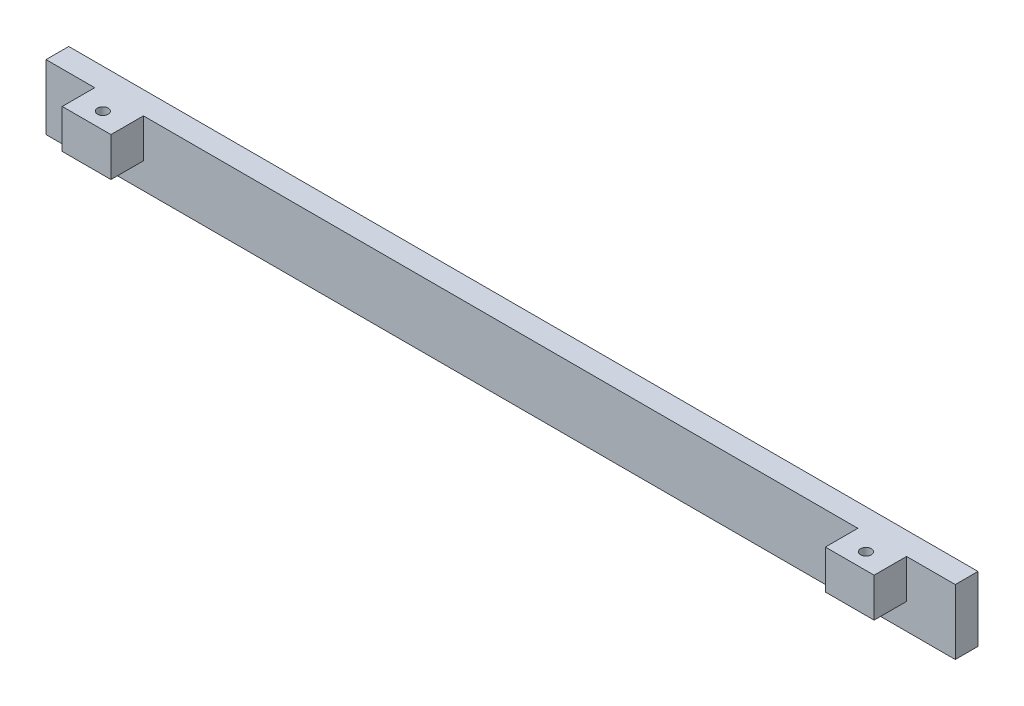
ISO-10303-21;
HEADER;
FILE_DESCRIPTION(('STEP AP214'),'2;1');
FILE_NAME('part.step','',(''),(''),'','','');
FILE_SCHEMA(('AUTOMOTIVE_DESIGN { 1 0 10303 214 1 1 1 1 }'));
ENDSEC;
DATA;
#1=APPLICATION_CONTEXT('core data for automotive mechanical design processes');
#2=APPLICATION_PROTOCOL_DEFINITION('international standard','automotive_design',2000,#1);
#3=PRODUCT_CONTEXT('',#1,'mechanical');
#4=PRODUCT('Part','Part','',(#3));
#5=PRODUCT_RELATED_PRODUCT_CATEGORY('part','',(#4));
#6=PRODUCT_DEFINITION_FORMATION('','',#4);
#7=PRODUCT_DEFINITION_CONTEXT('part definition',#1,'design');
#8=PRODUCT_DEFINITION('design','',#6,#7);
#9=PRODUCT_DEFINITION_SHAPE('','',#8);
#10=(LENGTH_UNIT() NAMED_UNIT(*) SI_UNIT(.MILLI.,.METRE.));
#11=(NAMED_UNIT(*) PLANE_ANGLE_UNIT() SI_UNIT($,.RADIAN.));
#12=(NAMED_UNIT(*) SI_UNIT($,.STERADIAN.) SOLID_ANGLE_UNIT());
#13=UNCERTAINTY_MEASURE_WITH_UNIT(LENGTH_MEASURE(1.E-05),#10,'distance_accuracy_value','');
#14=(GEOMETRIC_REPRESENTATION_CONTEXT(3) GLOBAL_UNCERTAINTY_ASSIGNED_CONTEXT((#13)) GLOBAL_UNIT_ASSIGNED_CONTEXT((#10,
#11,#12)) REPRESENTATION_CONTEXT('',''));
#15=CARTESIAN_POINT('',(0.,0.,0.));
#16=DIRECTION('',(0.,0.,1.));
#17=DIRECTION('',(1.,0.,0.));
#18=AXIS2_PLACEMENT_3D('',#15,#16,#17);
#19=CARTESIAN_POINT('',(140.,-9.99999999999999,3.5));
#20=DIRECTION('',(0.,0.,-1.));
#21=DIRECTION('',(-1.,0.,0.));
#22=AXIS2_PLACEMENT_3D('',#19,#20,#21);
#23=PLANE('',#22);
#24=DIRECTION('',(-1.,0.,0.));
#25=VECTOR('',#24,1.);
#26=CARTESIAN_POINT('',(140.,10.,3.5));
#27=LINE('',#26,#25);
#28=CARTESIAN_POINT('',(140.,10.,3.5));
#29=VERTEX_POINT('',#28);
#30=CARTESIAN_POINT('',(125.,10.,3.5));
#31=VERTEX_POINT('',#30);
#32=EDGE_CURVE('E46',#29,#31,#27,.T.);
#33=ORIENTED_EDGE('',*,*,#32,.T.);
#34=DIRECTION('',(0.,-1.,0.));
#35=VECTOR('',#34,1.);
#36=CARTESIAN_POINT('',(125.,10.,3.5));
#37=LINE('',#36,#35);
#38=CARTESIAN_POINT('',(125.,-1.99999999999999,3.5));
#39=VERTEX_POINT('',#38);
#40=EDGE_CURVE('E59',#31,#39,#37,.T.);
#41=ORIENTED_EDGE('',*,*,#40,.T.);
#42=DIRECTION('',(-1.,0.,0.));
#43=VECTOR('',#42,1.);
#44=CARTESIAN_POINT('',(125.,-1.99999999999999,3.5));
#45=LINE('',#44,#43);
#46=CARTESIAN_POINT('',(110.,-1.99999999999999,3.5));
#47=VERTEX_POINT('',#46);
#48=EDGE_CURVE('E54',#39,#47,#45,.T.);
#49=ORIENTED_EDGE('',*,*,#48,.T.);
#50=DIRECTION('',(0.,1.,0.));
#51=VECTOR('',#50,1.);
#52=CARTESIAN_POINT('',(110.,10.,3.5));
#53=LINE('',#52,#51);
#54=CARTESIAN_POINT('',(110.,10.,3.5));
#55=VERTEX_POINT('',#54);
#56=EDGE_CURVE('E159',#47,#55,#53,.T.);
#57=ORIENTED_EDGE('',*,*,#56,.T.);
#58=CARTESIAN_POINT('',(-110.,10.,3.5));
#59=VERTEX_POINT('',#58);
#60=EDGE_CURVE('E40',#55,#59,#27,.T.);
#61=ORIENTED_EDGE('',*,*,#60,.T.);
#62=DIRECTION('',(0.,1.,0.));
#63=VECTOR('',#62,1.);
#64=CARTESIAN_POINT('',(-110.,10.,3.5));
#65=LINE('',#64,#63);
#66=CARTESIAN_POINT('',(-110.,-1.99999999999999,3.5));
#67=VERTEX_POINT('',#66);
#68=EDGE_CURVE('E171',#67,#59,#65,.T.);
#69=ORIENTED_EDGE('',*,*,#68,.F.);
#70=DIRECTION('',(1.,0.,0.));
#71=VECTOR('',#70,1.);
#72=CARTESIAN_POINT('',(-125.,-1.99999999999999,3.5));
#73=LINE('',#72,#71);
#74=CARTESIAN_POINT('',(-125.,-1.99999999999999,3.5));
#75=VERTEX_POINT('',#74);
#76=EDGE_CURVE('E178',#75,#67,#73,.T.);
#77=ORIENTED_EDGE('',*,*,#76,.F.);
#78=DIRECTION('',(0.,-1.,0.));
#79=VECTOR('',#78,1.);
#80=CARTESIAN_POINT('',(-125.,10.,3.5));
#81=LINE('',#80,#79);
#82=CARTESIAN_POINT('',(-125.,10.,3.5));
#83=VERTEX_POINT('',#82);
#84=EDGE_CURVE('E136',#83,#75,#81,.T.);
#85=ORIENTED_EDGE('',*,*,#84,.F.);
#86=CARTESIAN_POINT('',(-140.,10.,3.5));
#87=VERTEX_POINT('',#86);
#88=EDGE_CURVE('E207',#83,#87,#27,.T.);
#89=ORIENTED_EDGE('',*,*,#88,.T.);
#90=DIRECTION('',(0.,-1.,0.));
#91=VECTOR('',#90,1.);
#92=CARTESIAN_POINT('',(-140.,-9.99999999999999,3.5));
#93=LINE('',#92,#91);
#94=CARTESIAN_POINT('',(-140.,-9.99999999999999,3.5));
#95=VERTEX_POINT('',#94);
#96=EDGE_CURVE('E223',#87,#95,#93,.T.);
#97=ORIENTED_EDGE('',*,*,#96,.T.);
#98=DIRECTION('',(-1.,0.,0.));
#99=VECTOR('',#98,1.);
#100=CARTESIAN_POINT('',(140.,-9.99999999999999,3.5));
#101=LINE('',#100,#99);
#102=CARTESIAN_POINT('',(140.,-9.99999999999999,3.5));
#103=VERTEX_POINT('',#102);
#104=EDGE_CURVE('E209',#103,#95,#101,.T.);
#105=ORIENTED_EDGE('',*,*,#104,.F.);
#106=DIRECTION('',(0.,-1.,0.));
#107=VECTOR('',#106,1.);
#108=CARTESIAN_POINT('',(140.,-9.99999999999999,3.5));
#109=LINE('',#108,#107);
#110=EDGE_CURVE('E231',#29,#103,#109,.T.);
#111=ORIENTED_EDGE('',*,*,#110,.F.);
#112=EDGE_LOOP('',(#33,#41,#49,#57,#61,#69,#77,#85,#89,#97,#105,#111));
#113=FACE_BOUND('',#112,.T.);
#114=ADVANCED_FACE('F36',(#113),#23,.F.);
#115=CARTESIAN_POINT('',(140.,-9.99999999999999,-3.5));
#116=DIRECTION('',(0.,0.,1.));
#117=DIRECTION('',(1.,0.,0.));
#118=AXIS2_PLACEMENT_3D('',#115,#116,#117);
#119=PLANE('',#118);
#120=DIRECTION('',(0.,1.,0.));
#121=VECTOR('',#120,1.);
#122=CARTESIAN_POINT('',(-140.,-9.99999999999999,-3.5));
#123=LINE('',#122,#121);
#124=CARTESIAN_POINT('',(-140.,-9.99999999999999,-3.5));
#125=VERTEX_POINT('',#124);
#126=CARTESIAN_POINT('',(-140.,10.,-3.5));
#127=VERTEX_POINT('',#126);
#128=EDGE_CURVE('E227',#125,#127,#123,.T.);
#129=ORIENTED_EDGE('',*,*,#128,.T.);
#130=DIRECTION('',(-1.,0.,0.));
#131=VECTOR('',#130,1.);
#132=CARTESIAN_POINT('',(140.,10.,-3.5));
#133=LINE('',#132,#131);
#134=CARTESIAN_POINT('',(140.,10.,-3.5));
#135=VERTEX_POINT('',#134);
#136=EDGE_CURVE('E11',#135,#127,#133,.T.);
#137=ORIENTED_EDGE('',*,*,#136,.F.);
#138=DIRECTION('',(0.,1.,0.));
#139=VECTOR('',#138,1.);
#140=CARTESIAN_POINT('',(140.,-9.99999999999999,-3.5));
#141=LINE('',#140,#139);
#142=CARTESIAN_POINT('',(140.,-9.99999999999999,-3.5));
#143=VERTEX_POINT('',#142);
#144=EDGE_CURVE('E222',#143,#135,#141,.T.);
#145=ORIENTED_EDGE('',*,*,#144,.F.);
#146=DIRECTION('',(-1.,0.,0.));
#147=VECTOR('',#146,1.);
#148=CARTESIAN_POINT('',(140.,-9.99999999999999,-3.5));
#149=LINE('',#148,#147);
#150=EDGE_CURVE('E216',#143,#125,#149,.T.);
#151=ORIENTED_EDGE('',*,*,#150,.T.);
#152=EDGE_LOOP('',(#129,#137,#145,#151));
#153=FACE_BOUND('',#152,.T.);
#154=ADVANCED_FACE('F38',(#153),#119,.F.);
#155=CARTESIAN_POINT('',(140.,10.,3.5));
#156=DIRECTION('',(0.,-1.,0.));
#157=DIRECTION('',(0.,0.,-1.));
#158=AXIS2_PLACEMENT_3D('',#155,#156,#157);
#159=PLANE('',#158);
#160=CARTESIAN_POINT('',(117.5,10.,8.5));
#161=DIRECTION('',(0.,-1.,0.));
#162=DIRECTION('',(0.,0.,-1.));
#163=AXIS2_PLACEMENT_3D('',#160,#161,#162);
#164=CIRCLE('',#163,1.64999999999999);
#165=CARTESIAN_POINT('',(117.5,10.,6.85000000000001));
#166=VERTEX_POINT('',#165);
#167=EDGE_CURVE('E289',#166,#166,#164,.T.);
#168=ORIENTED_EDGE('',*,*,#167,.T.);
#169=EDGE_LOOP('',(#168));
#170=FACE_BOUND('',#169,.T.);
#171=CARTESIAN_POINT('',(-117.5,10.,8.49999999999993));
#172=DIRECTION('',(0.,-1.,0.));
#173=DIRECTION('',(0.,0.,-1.));
#174=AXIS2_PLACEMENT_3D('',#171,#172,#173);
#175=CIRCLE('',#174,1.64999999999999);
#176=CARTESIAN_POINT('',(-117.5,10.,6.84999999999994));
#177=VERTEX_POINT('',#176);
#178=EDGE_CURVE('E160',#177,#177,#175,.T.);
#179=ORIENTED_EDGE('',*,*,#178,.T.);
#180=EDGE_LOOP('',(#179));
#181=FACE_BOUND('',#180,.T.);
#182=DIRECTION('',(0.,0.,1.));
#183=VECTOR('',#182,1.);
#184=CARTESIAN_POINT('',(-140.,10.,3.5));
#185=LINE('',#184,#183);
#186=EDGE_CURVE('E225',#127,#87,#185,.T.);
#187=ORIENTED_EDGE('',*,*,#186,.T.);
#188=ORIENTED_EDGE('',*,*,#88,.F.);
#189=DIRECTION('',(0.,0.,-1.));
#190=VECTOR('',#189,1.);
#191=CARTESIAN_POINT('',(-125.,10.,13.5));
#192=LINE('',#191,#190);
#193=CARTESIAN_POINT('',(-125.,10.,13.5));
#194=VERTEX_POINT('',#193);
#195=EDGE_CURVE('E177',#194,#83,#192,.T.);
#196=ORIENTED_EDGE('',*,*,#195,.F.);
#197=DIRECTION('',(-1.,0.,0.));
#198=VECTOR('',#197,1.);
#199=CARTESIAN_POINT('',(-125.,10.,13.5));
#200=LINE('',#199,#198);
#201=CARTESIAN_POINT('',(-110.,10.,13.5));
#202=VERTEX_POINT('',#201);
#203=EDGE_CURVE('E175',#202,#194,#200,.T.);
#204=ORIENTED_EDGE('',*,*,#203,.F.);
#205=DIRECTION('',(0.,0.,-1.));
#206=VECTOR('',#205,1.);
#207=CARTESIAN_POINT('',(-110.,10.,13.5));
#208=LINE('',#207,#206);
#209=EDGE_CURVE('E191',#202,#59,#208,.T.);
#210=ORIENTED_EDGE('',*,*,#209,.T.);
#211=ORIENTED_EDGE('',*,*,#60,.F.);
#212=DIRECTION('',(0.,0.,-1.));
#213=VECTOR('',#212,1.);
#214=CARTESIAN_POINT('',(110.,10.,13.5));
#215=LINE('',#214,#213);
#216=CARTESIAN_POINT('',(110.,10.,13.5));
#217=VERTEX_POINT('',#216);
#218=EDGE_CURVE('E137',#217,#55,#215,.T.);
#219=ORIENTED_EDGE('',*,*,#218,.F.);
#220=DIRECTION('',(1.,0.,0.));
#221=VECTOR('',#220,1.);
#222=CARTESIAN_POINT('',(125.,10.,13.5));
#223=LINE('',#222,#221);
#224=CARTESIAN_POINT('',(125.,10.,13.5));
#225=VERTEX_POINT('',#224);
#226=EDGE_CURVE('E143',#217,#225,#223,.T.);
#227=ORIENTED_EDGE('',*,*,#226,.T.);
#228=DIRECTION('',(0.,0.,-1.));
#229=VECTOR('',#228,1.);
#230=CARTESIAN_POINT('',(125.,10.,13.5));
#231=LINE('',#230,#229);
#232=EDGE_CURVE('E128',#225,#31,#231,.T.);
#233=ORIENTED_EDGE('',*,*,#232,.T.);
#234=ORIENTED_EDGE('',*,*,#32,.F.);
#235=DIRECTION('',(0.,0.,1.));
#236=VECTOR('',#235,1.);
#237=CARTESIAN_POINT('',(140.,10.,3.5));
#238=LINE('',#237,#236);
#239=EDGE_CURVE('E233',#135,#29,#238,.T.);
#240=ORIENTED_EDGE('',*,*,#239,.F.);
#241=ORIENTED_EDGE('',*,*,#136,.T.);
#242=EDGE_LOOP('',(#187,#188,#196,#204,#210,#211,#219,#227,#233,#234,#240,#241));
#243=FACE_BOUND('',#242,.T.);
#244=ADVANCED_FACE('F149',(#170,#181,#243),#159,.F.);
#245=CARTESIAN_POINT('',(140.,-9.99999999999999,3.5));
#246=DIRECTION('',(0.,1.,0.));
#247=DIRECTION('',(0.,0.,1.));
#248=AXIS2_PLACEMENT_3D('',#245,#246,#247);
#249=PLANE('',#248);
#250=DIRECTION('',(0.,0.,-1.));
#251=VECTOR('',#250,1.);
#252=CARTESIAN_POINT('',(-140.,-9.99999999999999,3.5));
#253=LINE('',#252,#251);
#254=EDGE_CURVE('E220',#95,#125,#253,.T.);
#255=ORIENTED_EDGE('',*,*,#254,.T.);
#256=ORIENTED_EDGE('',*,*,#150,.F.);
#257=DIRECTION('',(0.,0.,-1.));
#258=VECTOR('',#257,1.);
#259=CARTESIAN_POINT('',(140.,-9.99999999999999,3.5));
#260=LINE('',#259,#258);
#261=EDGE_CURVE('E219',#103,#143,#260,.T.);
#262=ORIENTED_EDGE('',*,*,#261,.F.);
#263=ORIENTED_EDGE('',*,*,#104,.T.);
#264=EDGE_LOOP('',(#255,#256,#262,#263));
#265=FACE_BOUND('',#264,.T.);
#266=ADVANCED_FACE('F253',(#265),#249,.F.);
#267=CARTESIAN_POINT('',(140.,0.,0.));
#268=DIRECTION('',(-1.,0.,0.));
#269=DIRECTION('',(0.,0.,1.));
#270=AXIS2_PLACEMENT_3D('',#267,#268,#269);
#271=PLANE('',#270);
#272=ORIENTED_EDGE('',*,*,#144,.T.);
#273=ORIENTED_EDGE('',*,*,#239,.T.);
#274=ORIENTED_EDGE('',*,*,#110,.T.);
#275=ORIENTED_EDGE('',*,*,#261,.T.);
#276=EDGE_LOOP('',(#272,#273,#274,#275));
#277=FACE_BOUND('',#276,.T.);
#278=ADVANCED_FACE('F257',(#277),#271,.F.);
#279=CARTESIAN_POINT('',(-140.,0.,0.));
#280=DIRECTION('',(-1.,0.,0.));
#281=DIRECTION('',(0.,0.,1.));
#282=AXIS2_PLACEMENT_3D('',#279,#280,#281);
#283=PLANE('',#282);
#284=ORIENTED_EDGE('',*,*,#128,.F.);
#285=ORIENTED_EDGE('',*,*,#254,.F.);
#286=ORIENTED_EDGE('',*,*,#96,.F.);
#287=ORIENTED_EDGE('',*,*,#186,.F.);
#288=EDGE_LOOP('',(#284,#285,#286,#287));
#289=FACE_BOUND('',#288,.T.);
#290=ADVANCED_FACE('F248',(#289),#283,.T.);
#291=CARTESIAN_POINT('',(-125.,10.,13.5));
#292=DIRECTION('',(1.,0.,0.));
#293=DIRECTION('',(0.,0.,-1.));
#294=AXIS2_PLACEMENT_3D('',#291,#292,#293);
#295=PLANE('',#294);
#296=ORIENTED_EDGE('',*,*,#84,.T.);
#297=DIRECTION('',(0.,0.,-1.));
#298=VECTOR('',#297,1.);
#299=CARTESIAN_POINT('',(-125.,-1.99999999999999,13.5));
#300=LINE('',#299,#298);
#301=CARTESIAN_POINT('',(-125.,-1.99999999999999,13.5));
#302=VERTEX_POINT('',#301);
#303=EDGE_CURVE('E197',#302,#75,#300,.T.);
#304=ORIENTED_EDGE('',*,*,#303,.F.);
#305=DIRECTION('',(0.,-1.,0.));
#306=VECTOR('',#305,1.);
#307=CARTESIAN_POINT('',(-125.,10.,13.5));
#308=LINE('',#307,#306);
#309=EDGE_CURVE('E167',#194,#302,#308,.T.);
#310=ORIENTED_EDGE('',*,*,#309,.F.);
#311=ORIENTED_EDGE('',*,*,#195,.T.);
#312=EDGE_LOOP('',(#296,#304,#310,#311));
#313=FACE_BOUND('',#312,.T.);
#314=ADVANCED_FACE('F241',(#313),#295,.F.);
#315=CARTESIAN_POINT('',(-125.,-1.99999999999999,13.5));
#316=DIRECTION('',(0.,1.,0.));
#317=DIRECTION('',(0.,0.,1.));
#318=AXIS2_PLACEMENT_3D('',#315,#316,#317);
#319=PLANE('',#318);
#320=CARTESIAN_POINT('',(-117.5,-2.,8.49999999999993));
#321=DIRECTION('',(0.,-1.,0.));
#322=DIRECTION('',(0.,0.,-1.));
#323=AXIS2_PLACEMENT_3D('',#320,#321,#322);
#324=CIRCLE('',#323,1.64999999999998);
#325=CARTESIAN_POINT('',(-117.5,-2.,6.84999999999994));
#326=VERTEX_POINT('',#325);
#327=EDGE_CURVE('E293',#326,#326,#324,.T.);
#328=ORIENTED_EDGE('',*,*,#327,.F.);
#329=EDGE_LOOP('',(#328));
#330=FACE_BOUND('',#329,.T.);
#331=ORIENTED_EDGE('',*,*,#76,.T.);
#332=DIRECTION('',(0.,0.,-1.));
#333=VECTOR('',#332,1.);
#334=CARTESIAN_POINT('',(-110.,-1.99999999999999,13.5));
#335=LINE('',#334,#333);
#336=CARTESIAN_POINT('',(-110.,-1.99999999999999,13.5));
#337=VERTEX_POINT('',#336);
#338=EDGE_CURVE('E183',#337,#67,#335,.T.);
#339=ORIENTED_EDGE('',*,*,#338,.F.);
#340=DIRECTION('',(1.,0.,0.));
#341=VECTOR('',#340,1.);
#342=CARTESIAN_POINT('',(-125.,-1.99999999999999,13.5));
#343=LINE('',#342,#341);
#344=EDGE_CURVE('E170',#302,#337,#343,.T.);
#345=ORIENTED_EDGE('',*,*,#344,.F.);
#346=ORIENTED_EDGE('',*,*,#303,.T.);
#347=EDGE_LOOP('',(#331,#339,#345,#346));
#348=FACE_BOUND('',#347,.T.);
#349=ADVANCED_FACE('F239',(#330,#348),#319,.F.);
#350=CARTESIAN_POINT('',(-110.,10.,13.5));
#351=DIRECTION('',(-1.,0.,0.));
#352=DIRECTION('',(0.,0.,1.));
#353=AXIS2_PLACEMENT_3D('',#350,#351,#352);
#354=PLANE('',#353);
#355=ORIENTED_EDGE('',*,*,#68,.T.);
#356=ORIENTED_EDGE('',*,*,#209,.F.);
#357=DIRECTION('',(0.,1.,0.));
#358=VECTOR('',#357,1.);
#359=CARTESIAN_POINT('',(-110.,10.,13.5));
#360=LINE('',#359,#358);
#361=EDGE_CURVE('E173',#337,#202,#360,.T.);
#362=ORIENTED_EDGE('',*,*,#361,.F.);
#363=ORIENTED_EDGE('',*,*,#338,.T.);
#364=EDGE_LOOP('',(#355,#356,#362,#363));
#365=FACE_BOUND('',#364,.T.);
#366=ADVANCED_FACE('F260',(#365),#354,.F.);
#367=CARTESIAN_POINT('',(0.,0.,13.5));
#368=DIRECTION('',(0.,0.,1.));
#369=DIRECTION('',(1.,0.,0.));
#370=AXIS2_PLACEMENT_3D('',#367,#368,#369);
#371=PLANE('',#370);
#372=ORIENTED_EDGE('',*,*,#309,.T.);
#373=ORIENTED_EDGE('',*,*,#344,.T.);
#374=ORIENTED_EDGE('',*,*,#361,.T.);
#375=ORIENTED_EDGE('',*,*,#203,.T.);
#376=EDGE_LOOP('',(#372,#373,#374,#375));
#377=FACE_BOUND('',#376,.T.);
#378=ADVANCED_FACE('F263',(#377),#371,.T.);
#379=CARTESIAN_POINT('',(125.,10.,13.5));
#380=DIRECTION('',(1.,0.,0.));
#381=DIRECTION('',(0.,0.,-1.));
#382=AXIS2_PLACEMENT_3D('',#379,#380,#381);
#383=PLANE('',#382);
#384=ORIENTED_EDGE('',*,*,#40,.F.);
#385=ORIENTED_EDGE('',*,*,#232,.F.);
#386=DIRECTION('',(0.,-1.,0.));
#387=VECTOR('',#386,1.);
#388=CARTESIAN_POINT('',(125.,10.,13.5));
#389=LINE('',#388,#387);
#390=CARTESIAN_POINT('',(125.,-1.99999999999999,13.5));
#391=VERTEX_POINT('',#390);
#392=EDGE_CURVE('E131',#225,#391,#389,.T.);
#393=ORIENTED_EDGE('',*,*,#392,.T.);
#394=DIRECTION('',(0.,0.,-1.));
#395=VECTOR('',#394,1.);
#396=CARTESIAN_POINT('',(125.,-1.99999999999999,13.5));
#397=LINE('',#396,#395);
#398=EDGE_CURVE('E157',#391,#39,#397,.T.);
#399=ORIENTED_EDGE('',*,*,#398,.T.);
#400=EDGE_LOOP('',(#384,#385,#393,#399));
#401=FACE_BOUND('',#400,.T.);
#402=ADVANCED_FACE('F130',(#401),#383,.T.);
#403=CARTESIAN_POINT('',(110.,10.,13.5));
#404=DIRECTION('',(-1.,0.,0.));
#405=DIRECTION('',(0.,0.,1.));
#406=AXIS2_PLACEMENT_3D('',#403,#404,#405);
#407=PLANE('',#406);
#408=ORIENTED_EDGE('',*,*,#56,.F.);
#409=DIRECTION('',(0.,0.,-1.));
#410=VECTOR('',#409,1.);
#411=CARTESIAN_POINT('',(110.,-1.99999999999999,13.5));
#412=LINE('',#411,#410);
#413=CARTESIAN_POINT('',(110.,-1.99999999999999,13.5));
#414=VERTEX_POINT('',#413);
#415=EDGE_CURVE('E164',#414,#47,#412,.T.);
#416=ORIENTED_EDGE('',*,*,#415,.F.);
#417=DIRECTION('',(0.,1.,0.));
#418=VECTOR('',#417,1.);
#419=CARTESIAN_POINT('',(110.,10.,13.5));
#420=LINE('',#419,#418);
#421=EDGE_CURVE('E151',#414,#217,#420,.T.);
#422=ORIENTED_EDGE('',*,*,#421,.T.);
#423=ORIENTED_EDGE('',*,*,#218,.T.);
#424=EDGE_LOOP('',(#408,#416,#422,#423));
#425=FACE_BOUND('',#424,.T.);
#426=ADVANCED_FACE('F270',(#425),#407,.T.);
#427=CARTESIAN_POINT('',(125.,-1.99999999999999,13.5));
#428=DIRECTION('',(0.,-1.,0.));
#429=DIRECTION('',(0.,0.,-1.));
#430=AXIS2_PLACEMENT_3D('',#427,#428,#429);
#431=PLANE('',#430);
#432=CARTESIAN_POINT('',(117.5,-2.,8.5));
#433=DIRECTION('',(0.,-1.,0.));
#434=DIRECTION('',(0.,0.,-1.));
#435=AXIS2_PLACEMENT_3D('',#432,#433,#434);
#436=CIRCLE('',#435,1.64999999999998);
#437=CARTESIAN_POINT('',(117.5,-2.,6.85000000000002));
#438=VERTEX_POINT('',#437);
#439=EDGE_CURVE('E298',#438,#438,#436,.T.);
#440=ORIENTED_EDGE('',*,*,#439,.F.);
#441=EDGE_LOOP('',(#440));
#442=FACE_BOUND('',#441,.T.);
#443=ORIENTED_EDGE('',*,*,#48,.F.);
#444=ORIENTED_EDGE('',*,*,#398,.F.);
#445=DIRECTION('',(-1.,0.,0.));
#446=VECTOR('',#445,1.);
#447=CARTESIAN_POINT('',(125.,-1.99999999999999,13.5));
#448=LINE('',#447,#446);
#449=EDGE_CURVE('E146',#391,#414,#448,.T.);
#450=ORIENTED_EDGE('',*,*,#449,.T.);
#451=ORIENTED_EDGE('',*,*,#415,.T.);
#452=EDGE_LOOP('',(#443,#444,#450,#451));
#453=FACE_BOUND('',#452,.T.);
#454=ADVANCED_FACE('F304',(#442,#453),#431,.T.);
#455=CARTESIAN_POINT('',(0.,0.,13.5));
#456=DIRECTION('',(0.,0.,1.));
#457=DIRECTION('',(-1.,0.,0.));
#458=AXIS2_PLACEMENT_3D('',#455,#456,#457);
#459=PLANE('',#458);
#460=ORIENTED_EDGE('',*,*,#392,.F.);
#461=ORIENTED_EDGE('',*,*,#226,.F.);
#462=ORIENTED_EDGE('',*,*,#421,.F.);
#463=ORIENTED_EDGE('',*,*,#449,.F.);
#464=EDGE_LOOP('',(#460,#461,#462,#463));
#465=FACE_BOUND('',#464,.T.);
#466=ADVANCED_FACE('F141',(#465),#459,.T.);
#467=CARTESIAN_POINT('',(-117.5,-1.99999999999999,8.49999999999993));
#468=DIRECTION('',(0.,-1.,0.));
#469=DIRECTION('',(0.,0.,-1.));
#470=AXIS2_PLACEMENT_3D('',#467,#468,#469);
#471=CYLINDRICAL_SURFACE('',#470,1.64999999999999);
#472=ORIENTED_EDGE('',*,*,#178,.F.);
#473=EDGE_LOOP('',(#472));
#474=FACE_BOUND('',#473,.T.);
#475=ORIENTED_EDGE('',*,*,#327,.T.);
#476=EDGE_LOOP('',(#475));
#477=FACE_BOUND('',#476,.T.);
#478=ADVANCED_FACE('F316',(#474,#477),#471,.F.);
#479=CARTESIAN_POINT('',(117.5,-1.99999999999999,8.5));
#480=DIRECTION('',(0.,-1.,0.));
#481=DIRECTION('',(0.,0.,-1.));
#482=AXIS2_PLACEMENT_3D('',#479,#480,#481);
#483=CYLINDRICAL_SURFACE('',#482,1.64999999999999);
#484=ORIENTED_EDGE('',*,*,#167,.F.);
#485=EDGE_LOOP('',(#484));
#486=FACE_BOUND('',#485,.T.);
#487=ORIENTED_EDGE('',*,*,#439,.T.);
#488=EDGE_LOOP('',(#487));
#489=FACE_BOUND('',#488,.T.);
#490=ADVANCED_FACE('F302',(#486,#489),#483,.F.);
#491=CLOSED_SHELL('',(#114,#154,#244,#266,#278,#290,#314,#349,#366,#378,#402,#426,#454,#466,
#478,#490));
#492=MANIFOLD_SOLID_BREP('B2',#491);
#493=ADVANCED_BREP_SHAPE_REPRESENTATION('',(#18,#492),#14);
#494=SHAPE_DEFINITION_REPRESENTATION(#9,#493);
ENDSEC;
END-ISO-10303-21;
